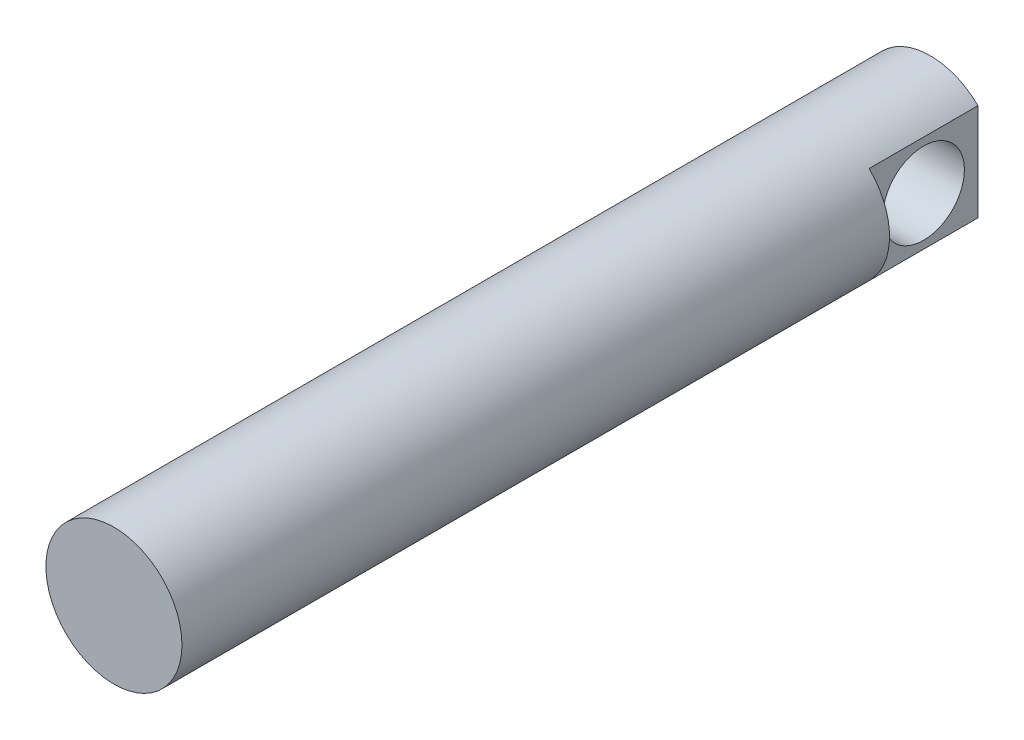
ISO-10303-21;
HEADER;
FILE_DESCRIPTION(('STEP AP214'),'2;1');
FILE_NAME('part.step','',(''),(''),'','','');
FILE_SCHEMA(('AUTOMOTIVE_DESIGN { 1 0 10303 214 1 1 1 1 }'));
ENDSEC;
DATA;
#1=APPLICATION_CONTEXT('core data for automotive mechanical design processes');
#2=APPLICATION_PROTOCOL_DEFINITION('international standard','automotive_design',2000,#1);
#3=PRODUCT_CONTEXT('',#1,'mechanical');
#4=PRODUCT('Part','Part','',(#3));
#5=PRODUCT_RELATED_PRODUCT_CATEGORY('part','',(#4));
#6=PRODUCT_DEFINITION_FORMATION('','',#4);
#7=PRODUCT_DEFINITION_CONTEXT('part definition',#1,'design');
#8=PRODUCT_DEFINITION('design','',#6,#7);
#9=PRODUCT_DEFINITION_SHAPE('','',#8);
#10=(LENGTH_UNIT() NAMED_UNIT(*) SI_UNIT(.MILLI.,.METRE.));
#11=(NAMED_UNIT(*) PLANE_ANGLE_UNIT() SI_UNIT($,.RADIAN.));
#12=(NAMED_UNIT(*) SI_UNIT($,.STERADIAN.) SOLID_ANGLE_UNIT());
#13=UNCERTAINTY_MEASURE_WITH_UNIT(LENGTH_MEASURE(1.E-05),#10,'distance_accuracy_value','');
#14=(GEOMETRIC_REPRESENTATION_CONTEXT(3) GLOBAL_UNCERTAINTY_ASSIGNED_CONTEXT((#13)) GLOBAL_UNIT_ASSIGNED_CONTEXT((#10,
#11,#12)) REPRESENTATION_CONTEXT('',''));
#15=CARTESIAN_POINT('',(0.,0.,0.));
#16=DIRECTION('',(0.,0.,1.));
#17=DIRECTION('',(1.,0.,0.));
#18=AXIS2_PLACEMENT_3D('',#15,#16,#17);
#19=CARTESIAN_POINT('',(0.,0.,120.));
#20=DIRECTION('',(0.,0.,-1.));
#21=DIRECTION('',(-1.,0.,0.));
#22=AXIS2_PLACEMENT_3D('',#19,#20,#21);
#23=CYLINDRICAL_SURFACE('',#22,10.);
#24=CARTESIAN_POINT('',(0.,0.,120.));
#25=DIRECTION('',(0.,0.,1.));
#26=DIRECTION('',(1.,0.,0.));
#27=AXIS2_PLACEMENT_3D('',#24,#25,#26);
#28=CIRCLE('',#27,10.);
#29=CARTESIAN_POINT('',(10.,0.,120.));
#30=VERTEX_POINT('',#29);
#31=EDGE_CURVE('E11',#30,#30,#28,.T.);
#32=ORIENTED_EDGE('',*,*,#31,.F.);
#33=EDGE_LOOP('',(#32));
#34=FACE_BOUND('',#33,.T.);
#35=CARTESIAN_POINT('',(-1.04083408558608E-13,0.,16.));
#36=DIRECTION('',(0.,0.,-1.));
#37=DIRECTION('',(1.,0.,0.));
#38=AXIS2_PLACEMENT_3D('',#35,#36,#37);
#39=CIRCLE('',#38,9.99999999999993);
#40=CARTESIAN_POINT('',(-7.,-7.14142842854285,16.));
#41=VERTEX_POINT('',#40);
#42=CARTESIAN_POINT('',(-7.,7.14142842854285,16.));
#43=VERTEX_POINT('',#42);
#44=EDGE_CURVE('E78',#41,#43,#39,.T.);
#45=ORIENTED_EDGE('',*,*,#44,.F.);
#46=DIRECTION('',(0.,0.,-1.));
#47=VECTOR('',#46,1.);
#48=CARTESIAN_POINT('',(-7.,-7.14142842854285,16.));
#49=LINE('',#48,#47);
#50=CARTESIAN_POINT('',(-7.,-7.14142842854285,0.));
#51=VERTEX_POINT('',#50);
#52=EDGE_CURVE('E84',#41,#51,#49,.T.);
#53=ORIENTED_EDGE('',*,*,#52,.T.);
#54=CARTESIAN_POINT('',(0.,0.,0.));
#55=DIRECTION('',(0.,0.,1.));
#56=DIRECTION('',(1.,0.,0.));
#57=AXIS2_PLACEMENT_3D('',#54,#55,#56);
#58=CIRCLE('',#57,10.);
#59=CARTESIAN_POINT('',(7.,-7.14142842854285,0.));
#60=VERTEX_POINT('',#59);
#61=EDGE_CURVE('E57',#51,#60,#58,.T.);
#62=ORIENTED_EDGE('',*,*,#61,.T.);
#63=DIRECTION('',(0.,0.,-1.));
#64=VECTOR('',#63,1.);
#65=CARTESIAN_POINT('',(7.,-7.14142842854285,16.));
#66=LINE('',#65,#64);
#67=CARTESIAN_POINT('',(7.,-7.14142842854285,16.));
#68=VERTEX_POINT('',#67);
#69=EDGE_CURVE('E99',#68,#60,#66,.T.);
#70=ORIENTED_EDGE('',*,*,#69,.F.);
#71=CARTESIAN_POINT('',(-1.04083408558608E-13,0.,16.));
#72=DIRECTION('',(0.,0.,-1.));
#73=DIRECTION('',(-1.,0.,0.));
#74=AXIS2_PLACEMENT_3D('',#71,#72,#73);
#75=CIRCLE('',#74,10.0000000000001);
#76=CARTESIAN_POINT('',(7.,7.14142842854285,16.));
#77=VERTEX_POINT('',#76);
#78=EDGE_CURVE('E94',#77,#68,#75,.T.);
#79=ORIENTED_EDGE('',*,*,#78,.F.);
#80=DIRECTION('',(0.,0.,-1.));
#81=VECTOR('',#80,1.);
#82=CARTESIAN_POINT('',(7.,7.14142842854285,16.));
#83=LINE('',#82,#81);
#84=CARTESIAN_POINT('',(7.,7.14142842854285,0.));
#85=VERTEX_POINT('',#84);
#86=EDGE_CURVE('E101',#77,#85,#83,.T.);
#87=ORIENTED_EDGE('',*,*,#86,.T.);
#88=CARTESIAN_POINT('',(-7.,7.14142842854285,0.));
#89=VERTEX_POINT('',#88);
#90=EDGE_CURVE('E41',#85,#89,#58,.T.);
#91=ORIENTED_EDGE('',*,*,#90,.T.);
#92=DIRECTION('',(0.,0.,-1.));
#93=VECTOR('',#92,1.);
#94=CARTESIAN_POINT('',(-7.,7.14142842854285,16.));
#95=LINE('',#94,#93);
#96=EDGE_CURVE('E49',#43,#89,#95,.T.);
#97=ORIENTED_EDGE('',*,*,#96,.F.);
#98=EDGE_LOOP('',(#45,#53,#62,#70,#79,#87,#91,#97));
#99=FACE_BOUND('',#98,.T.);
#100=ADVANCED_FACE('F33',(#34,#99),#23,.T.);
#101=CARTESIAN_POINT('',(0.,0.,120.));
#102=DIRECTION('',(0.,0.,1.));
#103=DIRECTION('',(1.,0.,0.));
#104=AXIS2_PLACEMENT_3D('',#101,#102,#103);
#105=PLANE('',#104);
#106=ORIENTED_EDGE('',*,*,#31,.T.);
#107=EDGE_LOOP('',(#106));
#108=FACE_BOUND('',#107,.T.);
#109=ADVANCED_FACE('F128',(#108),#105,.T.);
#110=CARTESIAN_POINT('',(0.,0.,0.));
#111=DIRECTION('',(0.,0.,1.));
#112=DIRECTION('',(1.,0.,0.));
#113=AXIS2_PLACEMENT_3D('',#110,#111,#112);
#114=PLANE('',#113);
#115=ORIENTED_EDGE('',*,*,#61,.F.);
#116=DIRECTION('',(0.,-1.,0.));
#117=VECTOR('',#116,1.);
#118=CARTESIAN_POINT('',(-7.,7.14142842854285,0.));
#119=LINE('',#118,#117);
#120=EDGE_CURVE('E81',#89,#51,#119,.T.);
#121=ORIENTED_EDGE('',*,*,#120,.F.);
#122=ORIENTED_EDGE('',*,*,#90,.F.);
#123=DIRECTION('',(0.,1.,0.));
#124=VECTOR('',#123,1.);
#125=CARTESIAN_POINT('',(7.,7.14142842854285,0.));
#126=LINE('',#125,#124);
#127=EDGE_CURVE('E90',#60,#85,#126,.T.);
#128=ORIENTED_EDGE('',*,*,#127,.F.);
#129=EDGE_LOOP('',(#115,#121,#122,#128));
#130=FACE_BOUND('',#129,.T.);
#131=ADVANCED_FACE('F109',(#130),#114,.F.);
#132=CARTESIAN_POINT('',(7.,7.14142842854285,16.));
#133=DIRECTION('',(-1.,0.,0.));
#134=DIRECTION('',(0.,-1.,0.));
#135=AXIS2_PLACEMENT_3D('',#132,#133,#134);
#136=PLANE('',#135);
#137=CARTESIAN_POINT('',(7.,0.,8.));
#138=DIRECTION('',(-1.,0.,0.));
#139=DIRECTION('',(0.,-1.,0.));
#140=AXIS2_PLACEMENT_3D('',#137,#138,#139);
#141=CIRCLE('',#140,6.);
#142=CARTESIAN_POINT('',(7.,-6.,8.));
#143=VERTEX_POINT('',#142);
#144=EDGE_CURVE('E110',#143,#143,#141,.T.);
#145=ORIENTED_EDGE('',*,*,#144,.T.);
#146=EDGE_LOOP('',(#145));
#147=FACE_BOUND('',#146,.T.);
#148=ORIENTED_EDGE('',*,*,#127,.T.);
#149=ORIENTED_EDGE('',*,*,#86,.F.);
#150=DIRECTION('',(0.,1.,0.));
#151=VECTOR('',#150,1.);
#152=CARTESIAN_POINT('',(7.,7.14142842854285,16.));
#153=LINE('',#152,#151);
#154=EDGE_CURVE('E96',#68,#77,#153,.T.);
#155=ORIENTED_EDGE('',*,*,#154,.F.);
#156=ORIENTED_EDGE('',*,*,#69,.T.);
#157=EDGE_LOOP('',(#148,#149,#155,#156));
#158=FACE_BOUND('',#157,.T.);
#159=ADVANCED_FACE('F106',(#147,#158),#136,.F.);
#160=CARTESIAN_POINT('',(-1.04083408558608E-13,0.,16.));
#161=DIRECTION('',(0.,0.,-1.));
#162=DIRECTION('',(-1.,0.,0.));
#163=AXIS2_PLACEMENT_3D('',#160,#161,#162);
#164=PLANE('',#163);
#165=ORIENTED_EDGE('',*,*,#78,.T.);
#166=ORIENTED_EDGE('',*,*,#154,.T.);
#167=EDGE_LOOP('',(#165,#166));
#168=FACE_BOUND('',#167,.T.);
#169=ADVANCED_FACE('F143',(#168),#164,.T.);
#170=CARTESIAN_POINT('',(-7.,7.14142842854285,16.));
#171=DIRECTION('',(1.,0.,0.));
#172=DIRECTION('',(0.,1.,0.));
#173=AXIS2_PLACEMENT_3D('',#170,#171,#172);
#174=PLANE('',#173);
#175=CARTESIAN_POINT('',(-7.,0.,8.));
#176=DIRECTION('',(1.,0.,0.));
#177=DIRECTION('',(0.,1.,0.));
#178=AXIS2_PLACEMENT_3D('',#175,#176,#177);
#179=CIRCLE('',#178,6.);
#180=CARTESIAN_POINT('',(-7.,6.,8.));
#181=VERTEX_POINT('',#180);
#182=EDGE_CURVE('E36',#181,#181,#179,.T.);
#183=ORIENTED_EDGE('',*,*,#182,.T.);
#184=EDGE_LOOP('',(#183));
#185=FACE_BOUND('',#184,.T.);
#186=ORIENTED_EDGE('',*,*,#120,.T.);
#187=ORIENTED_EDGE('',*,*,#52,.F.);
#188=DIRECTION('',(0.,-1.,0.));
#189=VECTOR('',#188,1.);
#190=CARTESIAN_POINT('',(-7.,7.14142842854285,16.));
#191=LINE('',#190,#189);
#192=EDGE_CURVE('E80',#43,#41,#191,.T.);
#193=ORIENTED_EDGE('',*,*,#192,.F.);
#194=ORIENTED_EDGE('',*,*,#96,.T.);
#195=EDGE_LOOP('',(#186,#187,#193,#194));
#196=FACE_BOUND('',#195,.T.);
#197=ADVANCED_FACE('F83',(#185,#196),#174,.F.);
#198=CARTESIAN_POINT('',(-1.04083408558608E-13,0.,16.));
#199=DIRECTION('',(0.,0.,1.));
#200=DIRECTION('',(1.,0.,0.));
#201=AXIS2_PLACEMENT_3D('',#198,#199,#200);
#202=PLANE('',#201);
#203=ORIENTED_EDGE('',*,*,#44,.T.);
#204=ORIENTED_EDGE('',*,*,#192,.T.);
#205=EDGE_LOOP('',(#203,#204));
#206=FACE_BOUND('',#205,.T.);
#207=ADVANCED_FACE('F79',(#206),#202,.F.);
#208=CARTESIAN_POINT('',(-10.,0.,8.));
#209=DIRECTION('',(1.,0.,0.));
#210=DIRECTION('',(0.,1.,0.));
#211=AXIS2_PLACEMENT_3D('',#208,#209,#210);
#212=CYLINDRICAL_SURFACE('',#211,6.);
#213=ORIENTED_EDGE('',*,*,#182,.F.);
#214=EDGE_LOOP('',(#213));
#215=FACE_BOUND('',#214,.T.);
#216=ORIENTED_EDGE('',*,*,#144,.F.);
#217=EDGE_LOOP('',(#216));
#218=FACE_BOUND('',#217,.T.);
#219=ADVANCED_FACE('F119',(#215,#218),#212,.F.);
#220=CLOSED_SHELL('',(#100,#109,#131,#159,#169,#197,#207,#219));
#221=MANIFOLD_SOLID_BREP('B2',#220);
#222=ADVANCED_BREP_SHAPE_REPRESENTATION('',(#18,#221),#14);
#223=SHAPE_DEFINITION_REPRESENTATION(#9,#222);
ENDSEC;
END-ISO-10303-21;
